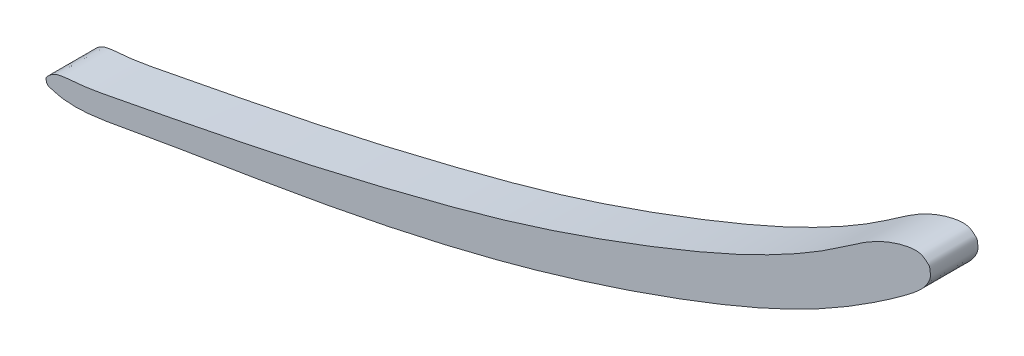
ISO-10303-21;
HEADER;
FILE_DESCRIPTION(('STEP AP214'),'2;1');
FILE_NAME('part.step','',(''),(''),'','','');
FILE_SCHEMA(('AUTOMOTIVE_DESIGN { 1 0 10303 214 1 1 1 1 }'));
ENDSEC;
DATA;
#1=APPLICATION_CONTEXT('core data for automotive mechanical design processes');
#2=APPLICATION_PROTOCOL_DEFINITION('international standard','automotive_design',2000,#1);
#3=PRODUCT_CONTEXT('',#1,'mechanical');
#4=PRODUCT('Part','Part','',(#3));
#5=PRODUCT_RELATED_PRODUCT_CATEGORY('part','',(#4));
#6=PRODUCT_DEFINITION_FORMATION('','',#4);
#7=PRODUCT_DEFINITION_CONTEXT('part definition',#1,'design');
#8=PRODUCT_DEFINITION('design','',#6,#7);
#9=PRODUCT_DEFINITION_SHAPE('','',#8);
#10=(LENGTH_UNIT() NAMED_UNIT(*) SI_UNIT(.MILLI.,.METRE.));
#11=(NAMED_UNIT(*) PLANE_ANGLE_UNIT() SI_UNIT($,.RADIAN.));
#12=(NAMED_UNIT(*) SI_UNIT($,.STERADIAN.) SOLID_ANGLE_UNIT());
#13=UNCERTAINTY_MEASURE_WITH_UNIT(LENGTH_MEASURE(1.E-05),#10,'distance_accuracy_value','');
#14=(GEOMETRIC_REPRESENTATION_CONTEXT(3) GLOBAL_UNCERTAINTY_ASSIGNED_CONTEXT((#13)) GLOBAL_UNIT_ASSIGNED_CONTEXT((#10,
#11,#12)) REPRESENTATION_CONTEXT('',''));
#15=CARTESIAN_POINT('',(0.,0.,0.));
#16=DIRECTION('',(0.,0.,1.));
#17=DIRECTION('',(1.,0.,0.));
#18=AXIS2_PLACEMENT_3D('',#15,#16,#17);
#19=CARTESIAN_POINT('',(89.1178681898534,0.,276.));
#20=CARTESIAN_POINT('',(89.0742169986861,0.0958845765762936,276.));
#21=CARTESIAN_POINT('',(88.9987749485821,0.169170631051319,276.));
#22=CARTESIAN_POINT('',(88.8424296670898,0.306074851322377,276.));
#23=CARTESIAN_POINT('',(88.7602762051681,0.369657802819916,276.));
#24=CARTESIAN_POINT('',(88.5174617325203,0.564866171710886,276.));
#25=CARTESIAN_POINT('',(88.3566859342927,0.69818204794525,276.));
#26=CARTESIAN_POINT('',(88.0977634530964,0.867828428146429,276.));
#27=CARTESIAN_POINT('',(88.0090816827371,0.919973837162188,276.));
#28=CARTESIAN_POINT('',(87.8227714845639,1.00767199228447,276.));
#29=CARTESIAN_POINT('',(87.7245776451449,1.04358629846885,276.));
#30=CARTESIAN_POINT('',(87.4230000178751,1.12873401693515,276.));
#31=CARTESIAN_POINT('',(87.2183620322605,1.15460343620886,276.));
#32=CARTESIAN_POINT('',(86.8055223511967,1.17564059695144,276.));
#33=CARTESIAN_POINT('',(86.5967118530386,1.17007161374314,276.));
#34=CARTESIAN_POINT('',(86.1846367538919,1.14299651602612,276.));
#35=CARTESIAN_POINT('',(85.9801180452431,1.12136119805681,276.));
#36=CARTESIAN_POINT('',(85.3706543796473,1.0346361066215,276.));
#37=CARTESIAN_POINT('',(84.9695714750816,0.948955626141819,276.));
#38=CARTESIAN_POINT('',(84.1723602770345,0.751178932009916,276.));
#39=CARTESIAN_POINT('',(83.7753991955491,0.637444000779947,276.));
#40=CARTESIAN_POINT('',(82.9917801682099,0.385807293321627,276.));
#41=CARTESIAN_POINT('',(82.6057200619319,0.248670010654695,276.));
#42=CARTESIAN_POINT('',(81.4633593462147,-0.193886084274908,276.));
#43=CARTESIAN_POINT('',(80.7234478750488,-0.531570394323634,276.));
#44=CARTESIAN_POINT('',(78.5672288164307,-1.66966678362361,276.));
#45=CARTESIAN_POINT('',(77.2103450704884,-2.58741316636798,276.));
#46=CARTESIAN_POINT('',(75.1894684124052,-3.99112267724603,276.));
#47=CARTESIAN_POINT('',(74.5176424703157,-4.46244438525234,276.));
#48=CARTESIAN_POINT('',(73.1654374426327,-5.3888402621813,276.));
#49=CARTESIAN_POINT('',(72.4860209696732,-5.8457430086772,276.));
#50=CARTESIAN_POINT('',(70.4296033366916,-7.18193893481749,276.));
#51=CARTESIAN_POINT('',(69.0337991952296,-8.0255139979948,276.));
#52=CARTESIAN_POINT('',(66.2076147715961,-9.64698333724726,276.));
#53=CARTESIAN_POINT('',(64.7776426121847,-10.42565288273,276.));
#54=CARTESIAN_POINT('',(61.8934743992197,-11.9369762992652,276.));
#55=CARTESIAN_POINT('',(60.4389886143591,-12.6690797971443,276.));
#56=CARTESIAN_POINT('',(57.5044746821373,-14.0847665578773,276.));
#57=CARTESIAN_POINT('',(56.0247878755834,-14.7689982312373,276.));
#58=CARTESIAN_POINT('',(51.5565755202156,-16.7663162762289,276.));
#59=CARTESIAN_POINT('',(48.5392251565912,-18.0268717545718,276.));
#60=CARTESIAN_POINT('',(42.4634404569804,-20.4602122708132,276.));
#61=CARTESIAN_POINT('',(39.4068233781362,-21.6301281636987,276.));
#62=CARTESIAN_POINT('',(33.2650985702871,-23.8898612064234,276.));
#63=CARTESIAN_POINT('',(30.1806519352909,-24.9806277819613,276.));
#64=CARTESIAN_POINT('',(23.9773447316259,-27.0631061587843,276.));
#65=CARTESIAN_POINT('',(20.8565207070627,-28.0515706758147,276.));
#66=CARTESIAN_POINT('',(14.5840755864421,-29.9149458418216,276.));
#67=CARTESIAN_POINT('',(11.4319240080799,-30.790801082271,276.));
#68=CARTESIAN_POINT('',(5.10634603529644,-32.4679418179326,276.));
#69=CARTESIAN_POINT('',(1.9343448816833,-33.2726403559887,276.));
#70=CARTESIAN_POINT('',(-4.41791845960839,-34.8416979432226,276.));
#71=CARTESIAN_POINT('',(-7.5989613601084,-35.605026918964,276.));
#72=CARTESIAN_POINT('',(-13.9724348388367,-37.0825288136075,276.));
#73=CARTESIAN_POINT('',(-17.1653328995725,-37.7946837972234,276.));
#74=CARTESIAN_POINT('',(-23.5632029622233,-39.1668753823725,276.));
#75=CARTESIAN_POINT('',(-26.7676687963802,-39.8298135601332,276.));
#76=CARTESIAN_POINT('',(-33.1835976137681,-41.121349068567,276.));
#77=CARTESIAN_POINT('',(-36.393787334757,-41.7560471679812,276.));
#78=CARTESIAN_POINT('',(-41.210361060968,-42.7014516954104,276.));
#79=CARTESIAN_POINT('',(-42.8159393819365,-43.0163268864299,276.));
#80=CARTESIAN_POINT('',(-46.0284698402421,-43.638986562104,276.));
#81=CARTESIAN_POINT('',(-47.635732286676,-43.9452191569418,276.));
#82=CARTESIAN_POINT('',(-50.0477342414535,-44.39840976761,276.));
#83=CARTESIAN_POINT('',(-50.8521767916115,-44.5469921907666,276.));
#84=CARTESIAN_POINT('',(-52.4677527076911,-44.8065903279498,276.));
#85=CARTESIAN_POINT('',(-53.2787579021254,-44.9162620008338,276.));
#86=CARTESIAN_POINT('',(-54.4989573773574,-45.0401182684316,276.));
#87=CARTESIAN_POINT('',(-54.9067015528952,-45.0719182653831,276.));
#88=CARTESIAN_POINT('',(-55.7221947526489,-45.1354727686864,276.));
#89=CARTESIAN_POINT('',(-56.1300037035934,-45.1701055612094,276.));
#90=CARTESIAN_POINT('',(-56.9397777649576,-45.2793894567856,276.));
#91=CARTESIAN_POINT('',(-57.3410083805892,-45.3498930499843,276.));
#92=CARTESIAN_POINT('',(-57.9237606593998,-45.5384772807772,276.));
#93=CARTESIAN_POINT('',(-58.1160992224398,-45.6169955513364,276.));
#94=CARTESIAN_POINT('',(-58.4726088932431,-45.8101849331893,276.));
#95=CARTESIAN_POINT('',(-58.6373338740185,-45.9268865139827,276.));
#96=CARTESIAN_POINT('',(-58.8728913238633,-46.1190737972042,276.));
#97=CARTESIAN_POINT('',(-58.9491222559676,-46.1865367747252,276.));
#98=CARTESIAN_POINT('',(-59.0991315048804,-46.325107592702,276.));
#99=CARTESIAN_POINT('',(-59.173974280613,-46.3948437306519,276.));
#100=CARTESIAN_POINT('',(-59.3187630614867,-46.5384423787849,276.));
#101=CARTESIAN_POINT('',(-59.3898948740593,-46.6113742110251,276.));
#102=CARTESIAN_POINT('',(-59.4745378037829,-46.7405546830615,276.));
#103=CARTESIAN_POINT('',(-59.4986777308371,-46.7884948586475,276.));
#104=CARTESIAN_POINT('',(-59.5271183086435,-46.8882192714554,276.));
#105=CARTESIAN_POINT('',(-59.532225211502,-46.9413378927046,276.));
#106=CARTESIAN_POINT('',(-59.5289837055449,-47.0976801834677,276.));
#107=CARTESIAN_POINT('',(-59.5038617396332,-47.2004070854652,276.));
#108=CARTESIAN_POINT('',(-59.4463261034724,-47.400366950875,276.));
#109=CARTESIAN_POINT('',(-59.4134299046185,-47.4987701265077,276.));
#110=CARTESIAN_POINT('',(-59.3218999778091,-47.6857465145858,276.));
#111=CARTESIAN_POINT('',(-59.2565654330993,-47.7744514163096,276.));
#112=CARTESIAN_POINT('',(-59.0804857903119,-47.893201097522,276.));
#113=CARTESIAN_POINT('',(-58.9761931108263,-47.9211485152552,276.));
#114=CARTESIAN_POINT('',(-58.7702003045474,-47.9713383024553,276.));
#115=CARTESIAN_POINT('',(-58.6664555219862,-47.9935872375714,276.));
#116=CARTESIAN_POINT('',(-58.4612056938842,-48.0466024432482,276.));
#117=CARTESIAN_POINT('',(-58.359185607303,-48.075396210668,276.));
#118=CARTESIAN_POINT('',(-58.0535139534027,-48.1633401202156,276.));
#119=CARTESIAN_POINT('',(-57.8503904998744,-48.226127623131,276.));
#120=CARTESIAN_POINT('',(-57.2371159604592,-48.3898045149147,276.));
#121=CARTESIAN_POINT('',(-56.8222813691223,-48.4610807055631,276.));
#122=CARTESIAN_POINT('',(-55.9851809625965,-48.5566464211459,276.));
#123=CARTESIAN_POINT('',(-55.5633466573003,-48.5836643272301,276.));
#124=CARTESIAN_POINT('',(-54.7156615294614,-48.6123042211832,276.));
#125=CARTESIAN_POINT('',(-54.2928932736224,-48.6119811542564,276.));
#126=CARTESIAN_POINT('',(-53.0277777287163,-48.5727401386484,276.));
#127=CARTESIAN_POINT('',(-52.1885301719923,-48.4943545601761,276.));
#128=CARTESIAN_POINT('',(-50.5140204173633,-48.2875846898574,276.));
#129=CARTESIAN_POINT('',(-49.6782816380235,-48.1606376671247,276.));
#130=CARTESIAN_POINT('',(-48.0108853704186,-47.8868337469123,276.));
#131=CARTESIAN_POINT('',(-47.1787977804266,-47.7406947956298,276.));
#132=CARTESIAN_POINT('',(-44.6835956904311,-47.2961945980332,276.));
#133=CARTESIAN_POINT('',(-43.0212077125482,-46.9936665116901,276.));
#134=CARTESIAN_POINT('',(-38.0285421951027,-46.1176356203253,276.));
#135=CARTESIAN_POINT('',(-34.6940386466228,-45.5689943247911,276.));
#136=CARTESIAN_POINT('',(-28.0243377908753,-44.47685215561,276.));
#137=CARTESIAN_POINT('',(-24.6893328421622,-43.9315766584225,276.));
#138=CARTESIAN_POINT('',(-18.0274099354382,-42.7952785302887,276.));
#139=CARTESIAN_POINT('',(-14.7002622009277,-42.2055371975198,276.));
#140=CARTESIAN_POINT('',(-8.05766281381674,-40.9598344058526,276.));
#141=CARTESIAN_POINT('',(-4.74200679989078,-40.3041639834597,276.));
#142=CARTESIAN_POINT('',(1.87113233159055,-38.9152878592617,276.));
#143=CARTESIAN_POINT('',(5.16904159881171,-38.1817776013454,276.));
#144=CARTESIAN_POINT('',(11.7447867416289,-36.6241930608982,276.));
#145=CARTESIAN_POINT('',(15.0237738952633,-35.8017890310097,276.));
#146=CARTESIAN_POINT('',(24.8134769359885,-33.1774628189692,276.));
#147=CARTESIAN_POINT('',(31.2833182649619,-31.2197544988182,276.));
#148=CARTESIAN_POINT('',(40.8936303972167,-27.9910219314038,276.));
#149=CARTESIAN_POINT('',(44.0835647870706,-26.8677550663098,276.));
#150=CARTESIAN_POINT('',(50.4137533293851,-24.5204935284502,276.));
#151=CARTESIAN_POINT('',(53.5546332259348,-23.2972245969315,276.));
#152=CARTESIAN_POINT('',(59.7680547827598,-20.7105970335322,276.));
#153=CARTESIAN_POINT('',(62.83978747981,-19.3455800706501,276.));
#154=CARTESIAN_POINT('',(68.8767296977389,-16.3971793762208,276.));
#155=CARTESIAN_POINT('',(71.8409743225119,-14.8118176596734,276.));
#156=CARTESIAN_POINT('',(76.1880135264733,-12.2301585863886,276.));
#157=CARTESIAN_POINT('',(77.6207483121691,-11.3362359607983,276.));
#158=CARTESIAN_POINT('',(80.4560825265774,-9.4866148523486,276.));
#159=CARTESIAN_POINT('',(81.8600576515627,-8.53050755537688,276.));
#160=CARTESIAN_POINT('',(83.9423139756928,-7.0592377113474,276.));
#161=CARTESIAN_POINT('',(84.6322267846934,-6.56287764129135,276.));
#162=CARTESIAN_POINT('',(85.6513868378692,-5.79686220909259,276.));
#163=CARTESIAN_POINT('',(85.9877658941551,-5.53734974341264,276.));
#164=CARTESIAN_POINT('',(86.6485552867138,-5.00337184178564,276.));
#165=CARTESIAN_POINT('',(86.9744708840246,-4.72923635808623,276.));
#166=CARTESIAN_POINT('',(87.5992705954472,-4.15542401036531,276.));
#167=CARTESIAN_POINT('',(87.8973751472282,-3.85575697759572,276.));
#168=CARTESIAN_POINT('',(88.3076017627743,-3.37329027195297,276.));
#169=CARTESIAN_POINT('',(88.438053126573,-3.20685244859161,276.));
#170=CARTESIAN_POINT('',(88.6819187957346,-2.85876848590804,276.));
#171=CARTESIAN_POINT('',(88.7955263664138,-2.67594931586051,276.));
#172=CARTESIAN_POINT('',(88.9978035340452,-2.29983346541227,276.));
#173=CARTESIAN_POINT('',(89.0876719602838,-2.10634774082894,276.));
#174=CARTESIAN_POINT('',(89.2268847890515,-1.69985959294489,276.));
#175=CARTESIAN_POINT('',(89.2751393008669,-1.49203667020986,276.));
#176=CARTESIAN_POINT('',(89.2889757282298,-1.17145530268006,276.));
#177=CARTESIAN_POINT('',(89.2823050424007,-1.06271045281691,276.));
#178=CARTESIAN_POINT('',(89.257508998371,-0.848995096387236,276.));
#179=CARTESIAN_POINT('',(89.2392131954619,-0.74299261355591,276.));
#180=CARTESIAN_POINT('',(89.20463744183,-0.530695343463102,276.));
#181=CARTESIAN_POINT('',(89.1916822279616,-0.423918459687662,276.));
#182=CARTESIAN_POINT('',(89.1750595282485,-0.263345658293189,276.));
#183=CARTESIAN_POINT('',(89.1700553003296,-0.209743572162863,276.));
#184=CARTESIAN_POINT('',(89.157410077417,-0.130085595663942,276.));
#185=CARTESIAN_POINT('',(89.152219954621,-0.103674321698207,276.));
#186=CARTESIAN_POINT('',(89.1382440286789,-0.0513731578756812,276.));
#187=CARTESIAN_POINT('',(89.1287809876452,-0.0239711441440654,276.));
#188=CARTESIAN_POINT('',(89.1178681898534,0.,276.));
#189=B_SPLINE_CURVE_WITH_KNOTS('',3,(#19,#20,#21,#22,#23,#24,#25,#26,#27,#28,#29,#30,#31,#32,
#33,#34,#35,#36,#37,#38,#39,#40,#41,#42,#43,#44,#45,#46,#47,#48,#49,#50,#51,#52,#53,#54,#55,#56,
#57,#58,#59,#60,#61,#62,#63,#64,#65,#66,#67,#68,#69,#70,#71,#72,#73,#74,#75,#76,#77,#78,#79,#80,
#81,#82,#83,#84,#85,#86,#87,#88,#89,#90,#91,#92,#93,#94,#95,#96,#97,#98,#99,#100,#101,#102,#103,
#104,#105,#106,#107,#108,#109,#110,#111,#112,#113,#114,#115,#116,#117,#118,#119,#120,#121,#122,
#123,#124,#125,#126,#127,#128,#129,#130,#131,#132,#133,#134,#135,#136,#137,#138,#139,#140,#141,
#142,#143,#144,#145,#146,#147,#148,#149,#150,#151,#152,#153,#154,#155,#156,#157,#158,#159,#160,
#161,#162,#163,#164,#165,#166,#167,#168,#169,#170,#171,#172,#173,#174,#175,#176,#177,#178,#179,
#180,#181,#182,#183,#184,#185,#186,#187,#188),.UNSPECIFIED.,.T.,.F.,(4,2,2,2,2,2,2,2,2,2,2,2,2,
2,2,2,2,2,2,2,2,2,2,2,2,2,2,2,2,2,2,2,2,2,2,2,2,2,2,2,2,2,2,2,2,2,2,2,2,2,2,2,2,2,2,2,2,2,2,2,2,
2,2,2,2,2,2,2,2,2,2,2,2,2,2,2,2,2,2,2,2,2,2,2,4),(0.,0.000976562500000017,0.00195312500000003,
0.00390625000000017,0.00488281250000019,0.0058593750000002,0.0078125000000001,0.009765625,
0.0117187499999999,0.0156249999999997,0.0195312499999995,0.0234374999999993,0.031249999999999,
0.0468749999999986,0.0546874999999984,0.0624999999999982,0.0781249999999977,0.0937499999999973,
0.109374999999997,0.124999999999996,0.156249999999995,0.187499999999994,0.218749999999993,
0.249999999999992,0.281249999999991,0.31249999999999,0.343749999999989,0.374999999999988,
0.406249999999986,0.437499999999985,0.453124999999985,0.468749999999984,0.476562499999984,
0.484374999999984,0.488281249999984,0.492187499999984,0.496093749999984,0.498046874999984,
0.499999999999984,0.500976562499983,0.501953124999983,0.502929687499983,0.503417968749984,
0.503906249999984,0.504882812499984,0.505859374999984,0.506835937499984,0.507812499999984,
0.508789062499984,0.509765624999984,0.511718749999984,0.515624999999984,0.519531249999984,
0.523437499999984,0.531249999999984,0.539062499999984,0.546874999999985,0.562499999999985,
0.593749999999986,0.624999999999987,0.656249999999988,0.68749999999999,0.718749999999991,
0.749999999999992,0.812499999999994,0.843749999999995,0.874999999999996,0.906249999999997,
0.937499999999998,0.953124999999998,0.968749999999999,0.976562499999999,0.980468749999999,
0.984375,0.98828125,0.990234375,0.9921875,0.994140625,0.99609375,0.9970703125,0.998046875,
0.9990234375,0.99951171875,0.999755859375,1.),.UNSPECIFIED.);
#190=DIRECTION('',(0.,0.,-1.));
#191=VECTOR('',#190,1.);
#192=SURFACE_OF_LINEAR_EXTRUSION('',#189,#191);
#193=CARTESIAN_POINT('',(89.1178681898534,0.,276.));
#194=CARTESIAN_POINT('',(89.1287809876452,-0.0239711441440654,276.));
#195=CARTESIAN_POINT('',(89.1382440286789,-0.0513731578756812,276.));
#196=CARTESIAN_POINT('',(89.152219954621,-0.103674321698207,276.));
#197=CARTESIAN_POINT('',(89.157410077417,-0.130085595663942,276.));
#198=CARTESIAN_POINT('',(89.1700553003296,-0.209743572162863,276.));
#199=CARTESIAN_POINT('',(89.1750595282485,-0.263345658293189,276.));
#200=CARTESIAN_POINT('',(89.1916822279616,-0.423918459687662,276.));
#201=CARTESIAN_POINT('',(89.20463744183,-0.530695343463102,276.));
#202=CARTESIAN_POINT('',(89.2392131954619,-0.74299261355591,276.));
#203=CARTESIAN_POINT('',(89.257508998371,-0.848995096387236,276.));
#204=CARTESIAN_POINT('',(89.2823050424007,-1.06271045281691,276.));
#205=CARTESIAN_POINT('',(89.2889757282298,-1.17145530268006,276.));
#206=CARTESIAN_POINT('',(89.2751393008669,-1.49203667020986,276.));
#207=CARTESIAN_POINT('',(89.2268847890515,-1.69985959294489,276.));
#208=CARTESIAN_POINT('',(89.0876719602838,-2.10634774082894,276.));
#209=CARTESIAN_POINT('',(88.9978035340452,-2.29983346541227,276.));
#210=CARTESIAN_POINT('',(88.7955263664138,-2.67594931586051,276.));
#211=CARTESIAN_POINT('',(88.6819187957346,-2.85876848590804,276.));
#212=CARTESIAN_POINT('',(88.438053126573,-3.20685244859161,276.));
#213=CARTESIAN_POINT('',(88.3076017627743,-3.37329027195297,276.));
#214=CARTESIAN_POINT('',(87.8973751472282,-3.85575697759572,276.));
#215=CARTESIAN_POINT('',(87.5992705954472,-4.15542401036531,276.));
#216=CARTESIAN_POINT('',(86.9744708840246,-4.72923635808623,276.));
#217=CARTESIAN_POINT('',(86.6485552867138,-5.00337184178564,276.));
#218=CARTESIAN_POINT('',(85.9877658941551,-5.53734974341264,276.));
#219=CARTESIAN_POINT('',(85.6513868378692,-5.79686220909259,276.));
#220=CARTESIAN_POINT('',(84.6322267846934,-6.56287764129135,276.));
#221=CARTESIAN_POINT('',(83.9423139756928,-7.0592377113474,276.));
#222=CARTESIAN_POINT('',(81.8600576515627,-8.53050755537688,276.));
#223=CARTESIAN_POINT('',(80.4560825265774,-9.4866148523486,276.));
#224=CARTESIAN_POINT('',(77.6207483121691,-11.3362359607983,276.));
#225=CARTESIAN_POINT('',(76.1880135264733,-12.2301585863886,276.));
#226=CARTESIAN_POINT('',(71.8409743225119,-14.8118176596734,276.));
#227=CARTESIAN_POINT('',(68.8767296977389,-16.3971793762208,276.));
#228=CARTESIAN_POINT('',(62.83978747981,-19.3455800706501,276.));
#229=CARTESIAN_POINT('',(59.7680547827598,-20.7105970335322,276.));
#230=CARTESIAN_POINT('',(53.5546332259348,-23.2972245969315,276.));
#231=CARTESIAN_POINT('',(50.4137533293851,-24.5204935284502,276.));
#232=CARTESIAN_POINT('',(44.0835647870706,-26.8677550663098,276.));
#233=CARTESIAN_POINT('',(40.8936303972167,-27.9910219314038,276.));
#234=CARTESIAN_POINT('',(31.2833182649619,-31.2197544988182,276.));
#235=CARTESIAN_POINT('',(24.8134769359885,-33.1774628189692,276.));
#236=CARTESIAN_POINT('',(15.0237738952633,-35.8017890310097,276.));
#237=CARTESIAN_POINT('',(11.7447867416289,-36.6241930608982,276.));
#238=CARTESIAN_POINT('',(5.16904159881171,-38.1817776013454,276.));
#239=CARTESIAN_POINT('',(1.87113233159055,-38.9152878592617,276.));
#240=CARTESIAN_POINT('',(-4.74200679989078,-40.3041639834597,276.));
#241=CARTESIAN_POINT('',(-8.05766281381674,-40.9598344058526,276.));
#242=CARTESIAN_POINT('',(-14.7002622009277,-42.2055371975198,276.));
#243=CARTESIAN_POINT('',(-18.0274099354382,-42.7952785302887,276.));
#244=CARTESIAN_POINT('',(-24.6893328421622,-43.9315766584225,276.));
#245=CARTESIAN_POINT('',(-28.0243377908753,-44.47685215561,276.));
#246=CARTESIAN_POINT('',(-34.6940386466228,-45.5689943247911,276.));
#247=CARTESIAN_POINT('',(-38.0285421951027,-46.1176356203253,276.));
#248=CARTESIAN_POINT('',(-43.0212077125482,-46.9936665116901,276.));
#249=CARTESIAN_POINT('',(-44.6835956904311,-47.2961945980332,276.));
#250=CARTESIAN_POINT('',(-47.1787977804266,-47.7406947956298,276.));
#251=CARTESIAN_POINT('',(-48.0108853704186,-47.8868337469123,276.));
#252=CARTESIAN_POINT('',(-49.6782816380235,-48.1606376671247,276.));
#253=CARTESIAN_POINT('',(-50.5140204173633,-48.2875846898574,276.));
#254=CARTESIAN_POINT('',(-52.1885301719923,-48.4943545601761,276.));
#255=CARTESIAN_POINT('',(-53.0277777287163,-48.5727401386484,276.));
#256=CARTESIAN_POINT('',(-54.2928932736224,-48.6119811542564,276.));
#257=CARTESIAN_POINT('',(-54.7156615294614,-48.6123042211832,276.));
#258=CARTESIAN_POINT('',(-55.5633466573003,-48.5836643272301,276.));
#259=CARTESIAN_POINT('',(-55.9851809625965,-48.5566464211459,276.));
#260=CARTESIAN_POINT('',(-56.8222813691223,-48.4610807055631,276.));
#261=CARTESIAN_POINT('',(-57.2371159604592,-48.3898045149147,276.));
#262=CARTESIAN_POINT('',(-57.8503904998744,-48.226127623131,276.));
#263=CARTESIAN_POINT('',(-58.0535139534027,-48.1633401202156,276.));
#264=CARTESIAN_POINT('',(-58.359185607303,-48.075396210668,276.));
#265=CARTESIAN_POINT('',(-58.4612056938842,-48.0466024432482,276.));
#266=CARTESIAN_POINT('',(-58.6664555219862,-47.9935872375714,276.));
#267=CARTESIAN_POINT('',(-58.7702003045474,-47.9713383024553,276.));
#268=CARTESIAN_POINT('',(-58.9761931108263,-47.9211485152552,276.));
#269=CARTESIAN_POINT('',(-59.0804857903119,-47.893201097522,276.));
#270=CARTESIAN_POINT('',(-59.2565654330993,-47.7744514163096,276.));
#271=CARTESIAN_POINT('',(-59.3218999778091,-47.6857465145858,276.));
#272=CARTESIAN_POINT('',(-59.4134299046185,-47.4987701265077,276.));
#273=CARTESIAN_POINT('',(-59.4463261034724,-47.400366950875,276.));
#274=CARTESIAN_POINT('',(-59.5038617396332,-47.2004070854652,276.));
#275=CARTESIAN_POINT('',(-59.5289837055449,-47.0976801834677,276.));
#276=CARTESIAN_POINT('',(-59.532225211502,-46.9413378927046,276.));
#277=CARTESIAN_POINT('',(-59.5271183086435,-46.8882192714554,276.));
#278=CARTESIAN_POINT('',(-59.4986777308371,-46.7884948586475,276.));
#279=CARTESIAN_POINT('',(-59.4745378037829,-46.7405546830615,276.));
#280=CARTESIAN_POINT('',(-59.3898948740593,-46.6113742110251,276.));
#281=CARTESIAN_POINT('',(-59.3187630614867,-46.5384423787849,276.));
#282=CARTESIAN_POINT('',(-59.173974280613,-46.3948437306519,276.));
#283=CARTESIAN_POINT('',(-59.0991315048804,-46.325107592702,276.));
#284=CARTESIAN_POINT('',(-58.9491222559676,-46.1865367747252,276.));
#285=CARTESIAN_POINT('',(-58.8728913238633,-46.1190737972042,276.));
#286=CARTESIAN_POINT('',(-58.6373338740185,-45.9268865139827,276.));
#287=CARTESIAN_POINT('',(-58.4726088932431,-45.8101849331893,276.));
#288=CARTESIAN_POINT('',(-58.1160992224398,-45.6169955513364,276.));
#289=CARTESIAN_POINT('',(-57.9237606593998,-45.5384772807772,276.));
#290=CARTESIAN_POINT('',(-57.3410083805892,-45.3498930499843,276.));
#291=CARTESIAN_POINT('',(-56.9397777649576,-45.2793894567856,276.));
#292=CARTESIAN_POINT('',(-56.1300037035934,-45.1701055612094,276.));
#293=CARTESIAN_POINT('',(-55.7221947526489,-45.1354727686864,276.));
#294=CARTESIAN_POINT('',(-54.9067015528952,-45.0719182653831,276.));
#295=CARTESIAN_POINT('',(-54.4989573773574,-45.0401182684316,276.));
#296=CARTESIAN_POINT('',(-53.2787579021254,-44.9162620008338,276.));
#297=CARTESIAN_POINT('',(-52.4677527076911,-44.8065903279498,276.));
#298=CARTESIAN_POINT('',(-50.8521767916115,-44.5469921907666,276.));
#299=CARTESIAN_POINT('',(-50.0477342414535,-44.39840976761,276.));
#300=CARTESIAN_POINT('',(-47.635732286676,-43.9452191569418,276.));
#301=CARTESIAN_POINT('',(-46.0284698402421,-43.638986562104,276.));
#302=CARTESIAN_POINT('',(-42.8159393819365,-43.0163268864299,276.));
#303=CARTESIAN_POINT('',(-41.210361060968,-42.7014516954104,276.));
#304=CARTESIAN_POINT('',(-36.393787334757,-41.7560471679812,276.));
#305=CARTESIAN_POINT('',(-33.1835976137681,-41.121349068567,276.));
#306=CARTESIAN_POINT('',(-26.7676687963802,-39.8298135601332,276.));
#307=CARTESIAN_POINT('',(-23.5632029622233,-39.1668753823725,276.));
#308=CARTESIAN_POINT('',(-17.1653328995725,-37.7946837972234,276.));
#309=CARTESIAN_POINT('',(-13.9724348388367,-37.0825288136075,276.));
#310=CARTESIAN_POINT('',(-7.5989613601084,-35.605026918964,276.));
#311=CARTESIAN_POINT('',(-4.41791845960839,-34.8416979432226,276.));
#312=CARTESIAN_POINT('',(1.9343448816833,-33.2726403559887,276.));
#313=CARTESIAN_POINT('',(5.10634603529644,-32.4679418179326,276.));
#314=CARTESIAN_POINT('',(11.4319240080799,-30.790801082271,276.));
#315=CARTESIAN_POINT('',(14.5840755864421,-29.9149458418216,276.));
#316=CARTESIAN_POINT('',(20.8565207070627,-28.0515706758147,276.));
#317=CARTESIAN_POINT('',(23.9773447316259,-27.0631061587843,276.));
#318=CARTESIAN_POINT('',(30.1806519352909,-24.9806277819613,276.));
#319=CARTESIAN_POINT('',(33.2650985702871,-23.8898612064234,276.));
#320=CARTESIAN_POINT('',(39.4068233781362,-21.6301281636987,276.));
#321=CARTESIAN_POINT('',(42.4634404569804,-20.4602122708132,276.));
#322=CARTESIAN_POINT('',(48.5392251565912,-18.0268717545718,276.));
#323=CARTESIAN_POINT('',(51.5565755202156,-16.7663162762289,276.));
#324=CARTESIAN_POINT('',(56.0247878755834,-14.7689982312373,276.));
#325=CARTESIAN_POINT('',(57.5044746821373,-14.0847665578773,276.));
#326=CARTESIAN_POINT('',(60.4389886143591,-12.6690797971443,276.));
#327=CARTESIAN_POINT('',(61.8934743992197,-11.9369762992652,276.));
#328=CARTESIAN_POINT('',(64.7776426121847,-10.42565288273,276.));
#329=CARTESIAN_POINT('',(66.2076147715961,-9.64698333724726,276.));
#330=CARTESIAN_POINT('',(69.0337991952296,-8.0255139979948,276.));
#331=CARTESIAN_POINT('',(70.4296033366916,-7.18193893481749,276.));
#332=CARTESIAN_POINT('',(72.4860209696732,-5.8457430086772,276.));
#333=CARTESIAN_POINT('',(73.1654374426327,-5.3888402621813,276.));
#334=CARTESIAN_POINT('',(74.5176424703157,-4.46244438525234,276.));
#335=CARTESIAN_POINT('',(75.1894684124052,-3.99112267724603,276.));
#336=CARTESIAN_POINT('',(77.2103450704884,-2.58741316636798,276.));
#337=CARTESIAN_POINT('',(78.5672288164307,-1.66966678362361,276.));
#338=CARTESIAN_POINT('',(80.7234478750488,-0.531570394323634,276.));
#339=CARTESIAN_POINT('',(81.4633593462147,-0.193886084274908,276.));
#340=CARTESIAN_POINT('',(82.6057200619319,0.248670010654695,276.));
#341=CARTESIAN_POINT('',(82.9917801682099,0.385807293321627,276.));
#342=CARTESIAN_POINT('',(83.7753991955491,0.637444000779947,276.));
#343=CARTESIAN_POINT('',(84.1723602770345,0.751178932009916,276.));
#344=CARTESIAN_POINT('',(84.9695714750816,0.948955626141819,276.));
#345=CARTESIAN_POINT('',(85.3706543796473,1.0346361066215,276.));
#346=CARTESIAN_POINT('',(85.9801180452431,1.12136119805681,276.));
#347=CARTESIAN_POINT('',(86.1846367538919,1.14299651602612,276.));
#348=CARTESIAN_POINT('',(86.5967118530386,1.17007161374314,276.));
#349=CARTESIAN_POINT('',(86.8055223511967,1.17564059695144,276.));
#350=CARTESIAN_POINT('',(87.2183620322605,1.15460343620886,276.));
#351=CARTESIAN_POINT('',(87.4230000178751,1.12873401693515,276.));
#352=CARTESIAN_POINT('',(87.7245776451449,1.04358629846885,276.));
#353=CARTESIAN_POINT('',(87.8227714845639,1.00767199228447,276.));
#354=CARTESIAN_POINT('',(88.0090816827371,0.919973837162188,276.));
#355=CARTESIAN_POINT('',(88.0977634530964,0.867828428146429,276.));
#356=CARTESIAN_POINT('',(88.3566859342927,0.69818204794525,276.));
#357=CARTESIAN_POINT('',(88.5174617325203,0.564866171710886,276.));
#358=CARTESIAN_POINT('',(88.7602762051681,0.369657802819916,276.));
#359=CARTESIAN_POINT('',(88.8424296670898,0.306074851322377,276.));
#360=CARTESIAN_POINT('',(88.9987749485821,0.169170631051319,276.));
#361=CARTESIAN_POINT('',(89.0742169986861,0.0958845765762936,276.));
#362=CARTESIAN_POINT('',(89.1178681898534,0.,276.));
#363=B_SPLINE_CURVE_WITH_KNOTS('',3,(#193,#194,#195,#196,#197,#198,#199,#200,#201,#202,#203,
#204,#205,#206,#207,#208,#209,#210,#211,#212,#213,#214,#215,#216,#217,#218,#219,#220,#221,#222,
#223,#224,#225,#226,#227,#228,#229,#230,#231,#232,#233,#234,#235,#236,#237,#238,#239,#240,#241,
#242,#243,#244,#245,#246,#247,#248,#249,#250,#251,#252,#253,#254,#255,#256,#257,#258,#259,#260,
#261,#262,#263,#264,#265,#266,#267,#268,#269,#270,#271,#272,#273,#274,#275,#276,#277,#278,#279,
#280,#281,#282,#283,#284,#285,#286,#287,#288,#289,#290,#291,#292,#293,#294,#295,#296,#297,#298,
#299,#300,#301,#302,#303,#304,#305,#306,#307,#308,#309,#310,#311,#312,#313,#314,#315,#316,#317,
#318,#319,#320,#321,#322,#323,#324,#325,#326,#327,#328,#329,#330,#331,#332,#333,#334,#335,#336,
#337,#338,#339,#340,#341,#342,#343,#344,#345,#346,#347,#348,#349,#350,#351,#352,#353,#354,#355,
#356,#357,#358,#359,#360,#361,#362),.UNSPECIFIED.,.T.,.F.,(4,2,2,2,2,2,2,2,2,2,2,2,2,2,2,2,2,2,
2,2,2,2,2,2,2,2,2,2,2,2,2,2,2,2,2,2,2,2,2,2,2,2,2,2,2,2,2,2,2,2,2,2,2,2,2,2,2,2,2,2,2,2,2,2,2,2,
2,2,2,2,2,2,2,2,2,2,2,2,2,2,2,2,2,2,4),(0.,0.000244140625,0.00048828125,0.0009765625,
0.001953125,0.0029296875,0.00390625000000011,0.00585937500000011,0.00781250000000011,
0.00976562500000022,0.0117187500000002,0.0156250000000004,0.0195312500000006,0.0234375000000008,
0.031250000000001,0.0468750000000016,0.0625000000000021,0.0937500000000031,0.125000000000004,
0.156250000000005,0.187500000000006,0.250000000000008,0.281250000000009,0.31250000000001,
0.343750000000012,0.375000000000013,0.406250000000014,0.437500000000015,0.453125000000015,
0.460937500000016,0.468750000000016,0.476562500000016,0.480468750000016,0.484375000000016,
0.488281250000016,0.490234375000016,0.491210937500016,0.492187500000016,0.493164062500016,
0.494140625000016,0.495117187500016,0.496093750000016,0.496582031250016,0.497070312500017,
0.498046875000017,0.499023437500017,0.500000000000016,0.501953125000016,0.503906250000016,
0.507812500000016,0.511718750000016,0.515625000000016,0.523437500000016,0.531250000000016,
0.546875000000015,0.562500000000015,0.593750000000014,0.625000000000012,0.656250000000011,
0.68750000000001,0.718750000000009,0.750000000000008,0.781250000000007,0.812500000000006,
0.843750000000005,0.875000000000004,0.890625000000003,0.906250000000003,0.921875000000002,
0.937500000000002,0.945312500000002,0.953125000000001,0.968750000000001,0.976562500000001,
0.98046875,0.984375,0.98828125,0.990234375,0.9921875,0.994140625,0.9951171875,0.99609375,
0.998046875,0.9990234375,1.),.UNSPECIFIED.);
#364=CARTESIAN_POINT('',(89.1178681898534,0.,276.));
#365=VERTEX_POINT('',#364);
#366=EDGE_CURVE('E10',#365,#365,#363,.F.);
#367=ORIENTED_EDGE('',*,*,#366,.F.);
#368=EDGE_LOOP('',(#367));
#369=FACE_BOUND('',#368,.T.);
#370=CARTESIAN_POINT('',(89.1178681898534,0.,268.));
#371=CARTESIAN_POINT('',(89.0742169986861,0.0958845765762936,268.));
#372=CARTESIAN_POINT('',(88.9987749485821,0.169170631051319,268.));
#373=CARTESIAN_POINT('',(88.8424296670898,0.306074851322377,268.));
#374=CARTESIAN_POINT('',(88.7602762051681,0.369657802819916,268.));
#375=CARTESIAN_POINT('',(88.5174617325203,0.564866171710886,268.));
#376=CARTESIAN_POINT('',(88.3566859342927,0.69818204794525,268.));
#377=CARTESIAN_POINT('',(88.0977634530964,0.867828428146429,268.));
#378=CARTESIAN_POINT('',(88.0090816827371,0.919973837162188,268.));
#379=CARTESIAN_POINT('',(87.8227714845639,1.00767199228447,268.));
#380=CARTESIAN_POINT('',(87.7245776451449,1.04358629846885,268.));
#381=CARTESIAN_POINT('',(87.4230000178751,1.12873401693515,268.));
#382=CARTESIAN_POINT('',(87.2183620322605,1.15460343620886,268.));
#383=CARTESIAN_POINT('',(86.8055223511967,1.17564059695144,268.));
#384=CARTESIAN_POINT('',(86.5967118530386,1.17007161374314,268.));
#385=CARTESIAN_POINT('',(86.1846367538919,1.14299651602612,268.));
#386=CARTESIAN_POINT('',(85.9801180452431,1.12136119805681,268.));
#387=CARTESIAN_POINT('',(85.3706543796473,1.0346361066215,268.));
#388=CARTESIAN_POINT('',(84.9695714750816,0.948955626141819,268.));
#389=CARTESIAN_POINT('',(84.1723602770345,0.751178932009916,268.));
#390=CARTESIAN_POINT('',(83.7753991955491,0.637444000779947,268.));
#391=CARTESIAN_POINT('',(82.9917801682099,0.385807293321627,268.));
#392=CARTESIAN_POINT('',(82.6057200619319,0.248670010654695,268.));
#393=CARTESIAN_POINT('',(81.4633593462147,-0.193886084274908,268.));
#394=CARTESIAN_POINT('',(80.7234478750488,-0.531570394323634,268.));
#395=CARTESIAN_POINT('',(78.5672288164307,-1.66966678362361,268.));
#396=CARTESIAN_POINT('',(77.2103450704884,-2.58741316636798,268.));
#397=CARTESIAN_POINT('',(75.1894684124052,-3.99112267724603,268.));
#398=CARTESIAN_POINT('',(74.5176424703157,-4.46244438525234,268.));
#399=CARTESIAN_POINT('',(73.1654374426327,-5.3888402621813,268.));
#400=CARTESIAN_POINT('',(72.4860209696732,-5.8457430086772,268.));
#401=CARTESIAN_POINT('',(70.4296033366916,-7.18193893481749,268.));
#402=CARTESIAN_POINT('',(69.0337991952296,-8.0255139979948,268.));
#403=CARTESIAN_POINT('',(66.2076147715961,-9.64698333724726,268.));
#404=CARTESIAN_POINT('',(64.7776426121847,-10.42565288273,268.));
#405=CARTESIAN_POINT('',(61.8934743992197,-11.9369762992652,268.));
#406=CARTESIAN_POINT('',(60.4389886143591,-12.6690797971443,268.));
#407=CARTESIAN_POINT('',(57.5044746821373,-14.0847665578773,268.));
#408=CARTESIAN_POINT('',(56.0247878755834,-14.7689982312373,268.));
#409=CARTESIAN_POINT('',(51.5565755202156,-16.7663162762289,268.));
#410=CARTESIAN_POINT('',(48.5392251565912,-18.0268717545718,268.));
#411=CARTESIAN_POINT('',(42.4634404569804,-20.4602122708132,268.));
#412=CARTESIAN_POINT('',(39.4068233781362,-21.6301281636987,268.));
#413=CARTESIAN_POINT('',(33.2650985702871,-23.8898612064234,268.));
#414=CARTESIAN_POINT('',(30.1806519352909,-24.9806277819613,268.));
#415=CARTESIAN_POINT('',(23.9773447316259,-27.0631061587843,268.));
#416=CARTESIAN_POINT('',(20.8565207070627,-28.0515706758147,268.));
#417=CARTESIAN_POINT('',(14.5840755864421,-29.9149458418216,268.));
#418=CARTESIAN_POINT('',(11.4319240080799,-30.790801082271,268.));
#419=CARTESIAN_POINT('',(5.10634603529644,-32.4679418179326,268.));
#420=CARTESIAN_POINT('',(1.9343448816833,-33.2726403559887,268.));
#421=CARTESIAN_POINT('',(-4.41791845960839,-34.8416979432226,268.));
#422=CARTESIAN_POINT('',(-7.5989613601084,-35.605026918964,268.));
#423=CARTESIAN_POINT('',(-13.9724348388367,-37.0825288136075,268.));
#424=CARTESIAN_POINT('',(-17.1653328995725,-37.7946837972234,268.));
#425=CARTESIAN_POINT('',(-23.5632029622233,-39.1668753823725,268.));
#426=CARTESIAN_POINT('',(-26.7676687963802,-39.8298135601332,268.));
#427=CARTESIAN_POINT('',(-33.1835976137681,-41.121349068567,268.));
#428=CARTESIAN_POINT('',(-36.393787334757,-41.7560471679812,268.));
#429=CARTESIAN_POINT('',(-41.210361060968,-42.7014516954104,268.));
#430=CARTESIAN_POINT('',(-42.8159393819365,-43.0163268864299,268.));
#431=CARTESIAN_POINT('',(-46.0284698402421,-43.638986562104,268.));
#432=CARTESIAN_POINT('',(-47.635732286676,-43.9452191569418,268.));
#433=CARTESIAN_POINT('',(-50.0477342414535,-44.39840976761,268.));
#434=CARTESIAN_POINT('',(-50.8521767916115,-44.5469921907666,268.));
#435=CARTESIAN_POINT('',(-52.4677527076911,-44.8065903279498,268.));
#436=CARTESIAN_POINT('',(-53.2787579021254,-44.9162620008338,268.));
#437=CARTESIAN_POINT('',(-54.4989573773574,-45.0401182684316,268.));
#438=CARTESIAN_POINT('',(-54.9067015528952,-45.0719182653831,268.));
#439=CARTESIAN_POINT('',(-55.7221947526489,-45.1354727686864,268.));
#440=CARTESIAN_POINT('',(-56.1300037035934,-45.1701055612094,268.));
#441=CARTESIAN_POINT('',(-56.9397777649576,-45.2793894567856,268.));
#442=CARTESIAN_POINT('',(-57.3410083805892,-45.3498930499843,268.));
#443=CARTESIAN_POINT('',(-57.9237606593998,-45.5384772807772,268.));
#444=CARTESIAN_POINT('',(-58.1160992224398,-45.6169955513364,268.));
#445=CARTESIAN_POINT('',(-58.4726088932431,-45.8101849331893,268.));
#446=CARTESIAN_POINT('',(-58.6373338740185,-45.9268865139827,268.));
#447=CARTESIAN_POINT('',(-58.8728913238633,-46.1190737972042,268.));
#448=CARTESIAN_POINT('',(-58.9491222559676,-46.1865367747252,268.));
#449=CARTESIAN_POINT('',(-59.0991315048804,-46.325107592702,268.));
#450=CARTESIAN_POINT('',(-59.173974280613,-46.3948437306519,268.));
#451=CARTESIAN_POINT('',(-59.3187630614867,-46.5384423787849,268.));
#452=CARTESIAN_POINT('',(-59.3898948740593,-46.6113742110251,268.));
#453=CARTESIAN_POINT('',(-59.4745378037829,-46.7405546830615,268.));
#454=CARTESIAN_POINT('',(-59.4986777308371,-46.7884948586475,268.));
#455=CARTESIAN_POINT('',(-59.5271183086435,-46.8882192714554,268.));
#456=CARTESIAN_POINT('',(-59.532225211502,-46.9413378927046,268.));
#457=CARTESIAN_POINT('',(-59.5289837055449,-47.0976801834677,268.));
#458=CARTESIAN_POINT('',(-59.5038617396332,-47.2004070854652,268.));
#459=CARTESIAN_POINT('',(-59.4463261034724,-47.400366950875,268.));
#460=CARTESIAN_POINT('',(-59.4134299046185,-47.4987701265077,268.));
#461=CARTESIAN_POINT('',(-59.3218999778091,-47.6857465145858,268.));
#462=CARTESIAN_POINT('',(-59.2565654330993,-47.7744514163096,268.));
#463=CARTESIAN_POINT('',(-59.0804857903119,-47.893201097522,268.));
#464=CARTESIAN_POINT('',(-58.9761931108263,-47.9211485152552,268.));
#465=CARTESIAN_POINT('',(-58.7702003045474,-47.9713383024553,268.));
#466=CARTESIAN_POINT('',(-58.6664555219862,-47.9935872375714,268.));
#467=CARTESIAN_POINT('',(-58.4612056938842,-48.0466024432482,268.));
#468=CARTESIAN_POINT('',(-58.359185607303,-48.075396210668,268.));
#469=CARTESIAN_POINT('',(-58.0535139534027,-48.1633401202156,268.));
#470=CARTESIAN_POINT('',(-57.8503904998744,-48.226127623131,268.));
#471=CARTESIAN_POINT('',(-57.2371159604592,-48.3898045149147,268.));
#472=CARTESIAN_POINT('',(-56.8222813691223,-48.4610807055631,268.));
#473=CARTESIAN_POINT('',(-55.9851809625965,-48.5566464211459,268.));
#474=CARTESIAN_POINT('',(-55.5633466573003,-48.5836643272301,268.));
#475=CARTESIAN_POINT('',(-54.7156615294614,-48.6123042211832,268.));
#476=CARTESIAN_POINT('',(-54.2928932736224,-48.6119811542564,268.));
#477=CARTESIAN_POINT('',(-53.0277777287163,-48.5727401386484,268.));
#478=CARTESIAN_POINT('',(-52.1885301719923,-48.4943545601761,268.));
#479=CARTESIAN_POINT('',(-50.5140204173633,-48.2875846898574,268.));
#480=CARTESIAN_POINT('',(-49.6782816380235,-48.1606376671247,268.));
#481=CARTESIAN_POINT('',(-48.0108853704186,-47.8868337469123,268.));
#482=CARTESIAN_POINT('',(-47.1787977804266,-47.7406947956298,268.));
#483=CARTESIAN_POINT('',(-44.6835956904311,-47.2961945980332,268.));
#484=CARTESIAN_POINT('',(-43.0212077125482,-46.9936665116901,268.));
#485=CARTESIAN_POINT('',(-38.0285421951027,-46.1176356203253,268.));
#486=CARTESIAN_POINT('',(-34.6940386466228,-45.5689943247911,268.));
#487=CARTESIAN_POINT('',(-28.0243377908753,-44.47685215561,268.));
#488=CARTESIAN_POINT('',(-24.6893328421622,-43.9315766584225,268.));
#489=CARTESIAN_POINT('',(-18.0274099354382,-42.7952785302887,268.));
#490=CARTESIAN_POINT('',(-14.7002622009277,-42.2055371975198,268.));
#491=CARTESIAN_POINT('',(-8.05766281381674,-40.9598344058526,268.));
#492=CARTESIAN_POINT('',(-4.74200679989078,-40.3041639834597,268.));
#493=CARTESIAN_POINT('',(1.87113233159055,-38.9152878592617,268.));
#494=CARTESIAN_POINT('',(5.16904159881171,-38.1817776013454,268.));
#495=CARTESIAN_POINT('',(11.7447867416289,-36.6241930608982,268.));
#496=CARTESIAN_POINT('',(15.0237738952633,-35.8017890310097,268.));
#497=CARTESIAN_POINT('',(24.8134769359885,-33.1774628189692,268.));
#498=CARTESIAN_POINT('',(31.2833182649619,-31.2197544988182,268.));
#499=CARTESIAN_POINT('',(40.8936303972167,-27.9910219314038,268.));
#500=CARTESIAN_POINT('',(44.0835647870706,-26.8677550663098,268.));
#501=CARTESIAN_POINT('',(50.4137533293851,-24.5204935284502,268.));
#502=CARTESIAN_POINT('',(53.5546332259348,-23.2972245969315,268.));
#503=CARTESIAN_POINT('',(59.7680547827598,-20.7105970335322,268.));
#504=CARTESIAN_POINT('',(62.83978747981,-19.3455800706501,268.));
#505=CARTESIAN_POINT('',(68.8767296977389,-16.3971793762208,268.));
#506=CARTESIAN_POINT('',(71.8409743225119,-14.8118176596734,268.));
#507=CARTESIAN_POINT('',(76.1880135264733,-12.2301585863886,268.));
#508=CARTESIAN_POINT('',(77.6207483121691,-11.3362359607983,268.));
#509=CARTESIAN_POINT('',(80.4560825265774,-9.4866148523486,268.));
#510=CARTESIAN_POINT('',(81.8600576515627,-8.53050755537688,268.));
#511=CARTESIAN_POINT('',(83.9423139756928,-7.0592377113474,268.));
#512=CARTESIAN_POINT('',(84.6322267846934,-6.56287764129135,268.));
#513=CARTESIAN_POINT('',(85.6513868378692,-5.79686220909259,268.));
#514=CARTESIAN_POINT('',(85.9877658941551,-5.53734974341264,268.));
#515=CARTESIAN_POINT('',(86.6485552867138,-5.00337184178564,268.));
#516=CARTESIAN_POINT('',(86.9744708840246,-4.72923635808623,268.));
#517=CARTESIAN_POINT('',(87.5992705954472,-4.15542401036531,268.));
#518=CARTESIAN_POINT('',(87.8973751472282,-3.85575697759572,268.));
#519=CARTESIAN_POINT('',(88.3076017627743,-3.37329027195297,268.));
#520=CARTESIAN_POINT('',(88.438053126573,-3.20685244859161,268.));
#521=CARTESIAN_POINT('',(88.6819187957346,-2.85876848590804,268.));
#522=CARTESIAN_POINT('',(88.7955263664138,-2.67594931586051,268.));
#523=CARTESIAN_POINT('',(88.9978035340452,-2.29983346541227,268.));
#524=CARTESIAN_POINT('',(89.0876719602838,-2.10634774082894,268.));
#525=CARTESIAN_POINT('',(89.2268847890515,-1.69985959294489,268.));
#526=CARTESIAN_POINT('',(89.2751393008669,-1.49203667020986,268.));
#527=CARTESIAN_POINT('',(89.2889757282298,-1.17145530268006,268.));
#528=CARTESIAN_POINT('',(89.2823050424007,-1.06271045281691,268.));
#529=CARTESIAN_POINT('',(89.257508998371,-0.848995096387236,268.));
#530=CARTESIAN_POINT('',(89.2392131954619,-0.74299261355591,268.));
#531=CARTESIAN_POINT('',(89.20463744183,-0.530695343463102,268.));
#532=CARTESIAN_POINT('',(89.1916822279616,-0.423918459687662,268.));
#533=CARTESIAN_POINT('',(89.1750595282485,-0.263345658293189,268.));
#534=CARTESIAN_POINT('',(89.1700553003296,-0.209743572162863,268.));
#535=CARTESIAN_POINT('',(89.157410077417,-0.130085595663942,268.));
#536=CARTESIAN_POINT('',(89.152219954621,-0.103674321698207,268.));
#537=CARTESIAN_POINT('',(89.1382440286789,-0.0513731578756812,268.));
#538=CARTESIAN_POINT('',(89.1287809876452,-0.0239711441440654,268.));
#539=CARTESIAN_POINT('',(89.1178681898534,0.,268.));
#540=B_SPLINE_CURVE_WITH_KNOTS('',3,(#370,#371,#372,#373,#374,#375,#376,#377,#378,#379,#380,
#381,#382,#383,#384,#385,#386,#387,#388,#389,#390,#391,#392,#393,#394,#395,#396,#397,#398,#399,
#400,#401,#402,#403,#404,#405,#406,#407,#408,#409,#410,#411,#412,#413,#414,#415,#416,#417,#418,
#419,#420,#421,#422,#423,#424,#425,#426,#427,#428,#429,#430,#431,#432,#433,#434,#435,#436,#437,
#438,#439,#440,#441,#442,#443,#444,#445,#446,#447,#448,#449,#450,#451,#452,#453,#454,#455,#456,
#457,#458,#459,#460,#461,#462,#463,#464,#465,#466,#467,#468,#469,#470,#471,#472,#473,#474,#475,
#476,#477,#478,#479,#480,#481,#482,#483,#484,#485,#486,#487,#488,#489,#490,#491,#492,#493,#494,
#495,#496,#497,#498,#499,#500,#501,#502,#503,#504,#505,#506,#507,#508,#509,#510,#511,#512,#513,
#514,#515,#516,#517,#518,#519,#520,#521,#522,#523,#524,#525,#526,#527,#528,#529,#530,#531,#532,
#533,#534,#535,#536,#537,#538,#539),.UNSPECIFIED.,.T.,.F.,(4,2,2,2,2,2,2,2,2,2,2,2,2,2,2,2,2,2,
2,2,2,2,2,2,2,2,2,2,2,2,2,2,2,2,2,2,2,2,2,2,2,2,2,2,2,2,2,2,2,2,2,2,2,2,2,2,2,2,2,2,2,2,2,2,2,2,
2,2,2,2,2,2,2,2,2,2,2,2,2,2,2,2,2,2,4),(0.,0.000976562500000017,0.00195312500000003,
0.00390625000000017,0.00488281250000019,0.0058593750000002,0.0078125000000001,0.009765625,
0.0117187499999999,0.0156249999999997,0.0195312499999995,0.0234374999999993,0.031249999999999,
0.0468749999999986,0.0546874999999984,0.0624999999999982,0.0781249999999977,0.0937499999999973,
0.109374999999997,0.124999999999996,0.156249999999995,0.187499999999994,0.218749999999993,
0.249999999999992,0.281249999999991,0.31249999999999,0.343749999999989,0.374999999999988,
0.406249999999986,0.437499999999985,0.453124999999985,0.468749999999984,0.476562499999984,
0.484374999999984,0.488281249999984,0.492187499999984,0.496093749999984,0.498046874999984,
0.499999999999984,0.500976562499983,0.501953124999983,0.502929687499983,0.503417968749984,
0.503906249999984,0.504882812499984,0.505859374999984,0.506835937499984,0.507812499999984,
0.508789062499984,0.509765624999984,0.511718749999984,0.515624999999984,0.519531249999984,
0.523437499999984,0.531249999999984,0.539062499999984,0.546874999999985,0.562499999999985,
0.593749999999986,0.624999999999987,0.656249999999988,0.68749999999999,0.718749999999991,
0.749999999999992,0.812499999999994,0.843749999999995,0.874999999999996,0.906249999999997,
0.937499999999998,0.953124999999998,0.968749999999999,0.976562499999999,0.980468749999999,
0.984375,0.98828125,0.990234375,0.9921875,0.994140625,0.99609375,0.9970703125,0.998046875,
0.9990234375,0.99951171875,0.999755859375,1.),.UNSPECIFIED.);
#541=CARTESIAN_POINT('',(89.1178681898534,0.,268.));
#542=VERTEX_POINT('',#541);
#543=EDGE_CURVE('E38',#542,#542,#540,.T.);
#544=ORIENTED_EDGE('',*,*,#543,.T.);
#545=EDGE_LOOP('',(#544));
#546=FACE_BOUND('',#545,.T.);
#547=ADVANCED_FACE('F28',(#369,#546),#192,.F.);
#548=CARTESIAN_POINT('',(-58.794372173919,-46.055011369467,276.));
#549=DIRECTION('',(0.,0.,-1.));
#550=DIRECTION('',(-1.,0.,0.));
#551=AXIS2_PLACEMENT_3D('',#548,#549,#550);
#552=PLANE('',#551);
#553=ORIENTED_EDGE('',*,*,#366,.T.);
#554=EDGE_LOOP('',(#553));
#555=FACE_BOUND('',#554,.T.);
#556=ADVANCED_FACE('F69',(#555),#552,.F.);
#557=CARTESIAN_POINT('',(-58.794372173919,-46.055011369467,268.));
#558=DIRECTION('',(0.,0.,-1.));
#559=DIRECTION('',(-1.,0.,0.));
#560=AXIS2_PLACEMENT_3D('',#557,#558,#559);
#561=PLANE('',#560);
#562=ORIENTED_EDGE('',*,*,#543,.F.);
#563=EDGE_LOOP('',(#562));
#564=FACE_BOUND('',#563,.T.);
#565=ADVANCED_FACE('F77',(#564),#561,.T.);
#566=CLOSED_SHELL('',(#547,#556,#565));
#567=MANIFOLD_SOLID_BREP('B2',#566);
#568=ADVANCED_BREP_SHAPE_REPRESENTATION('',(#18,#567),#14);
#569=SHAPE_DEFINITION_REPRESENTATION(#9,#568);
ENDSEC;
END-ISO-10303-21;
